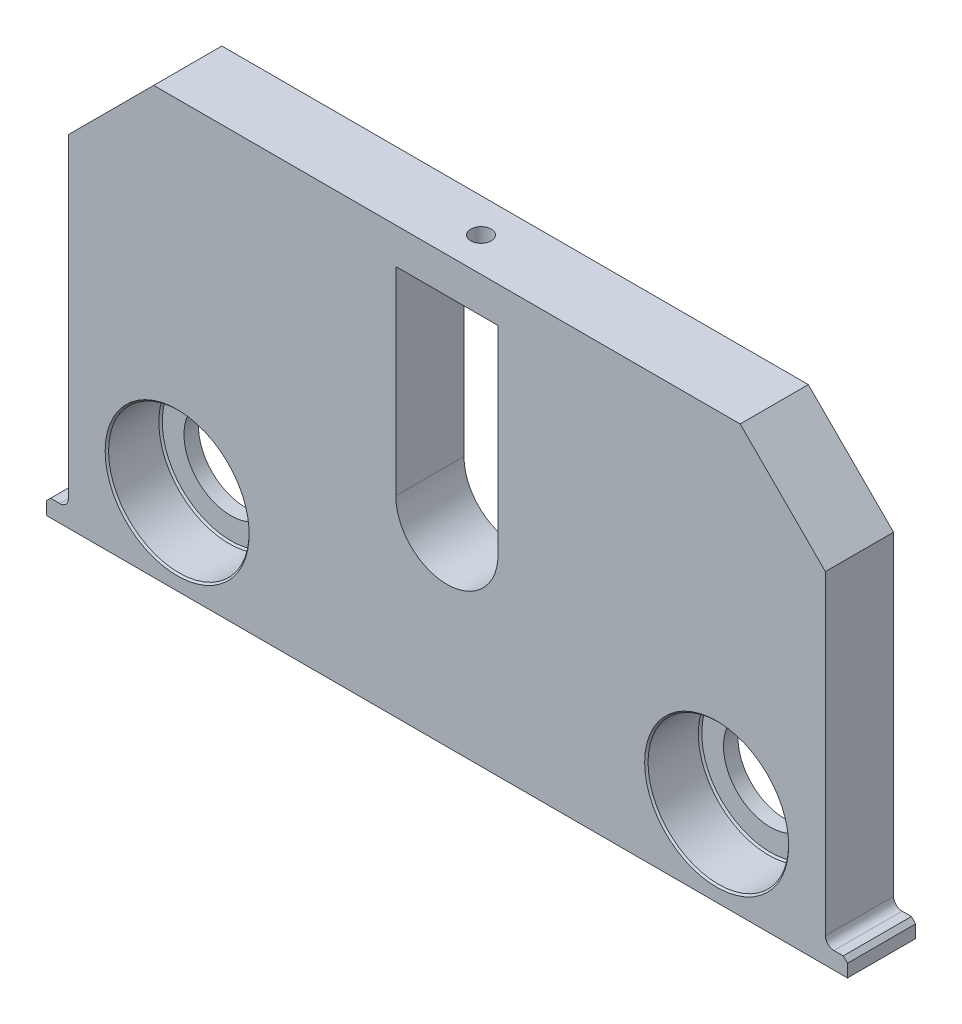
ISO-10303-21;
HEADER;
FILE_DESCRIPTION(('STEP AP214'),'2;1');
FILE_NAME('part.step','',(''),(''),'','','');
FILE_SCHEMA(('AUTOMOTIVE_DESIGN { 1 0 10303 214 1 1 1 1 }'));
ENDSEC;
DATA;
#1=APPLICATION_CONTEXT('core data for automotive mechanical design processes');
#2=APPLICATION_PROTOCOL_DEFINITION('international standard','automotive_design',2000,#1);
#3=PRODUCT_CONTEXT('',#1,'mechanical');
#4=PRODUCT('Part','Part','',(#3));
#5=PRODUCT_RELATED_PRODUCT_CATEGORY('part','',(#4));
#6=PRODUCT_DEFINITION_FORMATION('','',#4);
#7=PRODUCT_DEFINITION_CONTEXT('part definition',#1,'design');
#8=PRODUCT_DEFINITION('design','',#6,#7);
#9=PRODUCT_DEFINITION_SHAPE('','',#8);
#10=(LENGTH_UNIT() NAMED_UNIT(*) SI_UNIT(.MILLI.,.METRE.));
#11=(NAMED_UNIT(*) PLANE_ANGLE_UNIT() SI_UNIT($,.RADIAN.));
#12=(NAMED_UNIT(*) SI_UNIT($,.STERADIAN.) SOLID_ANGLE_UNIT());
#13=UNCERTAINTY_MEASURE_WITH_UNIT(LENGTH_MEASURE(1.E-05),#10,'distance_accuracy_value','');
#14=(GEOMETRIC_REPRESENTATION_CONTEXT(3) GLOBAL_UNCERTAINTY_ASSIGNED_CONTEXT((#13)) GLOBAL_UNIT_ASSIGNED_CONTEXT((#10,
#11,#12)) REPRESENTATION_CONTEXT('',''));
#15=CARTESIAN_POINT('',(0.,0.,0.));
#16=DIRECTION('',(0.,0.,1.));
#17=DIRECTION('',(1.,0.,0.));
#18=AXIS2_PLACEMENT_3D('',#15,#16,#17);
#19=CARTESIAN_POINT('',(-316.5,100.,40.));
#20=DIRECTION('',(0.,0.,-1.));
#21=DIRECTION('',(-1.,0.,0.));
#22=AXIS2_PLACEMENT_3D('',#19,#20,#21);
#23=CYLINDRICAL_SURFACE('',#22,55.);
#24=CARTESIAN_POINT('',(-316.5,100.,-40.));
#25=DIRECTION('',(0.,0.,1.));
#26=DIRECTION('',(1.,0.,0.));
#27=AXIS2_PLACEMENT_3D('',#24,#25,#26);
#28=CIRCLE('',#27,55.);
#29=CARTESIAN_POINT('',(-261.5,100.,-40.));
#30=VERTEX_POINT('',#29);
#31=EDGE_CURVE('E208',#30,#30,#28,.T.);
#32=ORIENTED_EDGE('',*,*,#31,.F.);
#33=EDGE_LOOP('',(#32));
#34=FACE_BOUND('',#33,.T.);
#35=CARTESIAN_POINT('',(-316.5,100.,-23.));
#36=DIRECTION('',(0.,0.,1.));
#37=DIRECTION('',(1.,0.,0.));
#38=AXIS2_PLACEMENT_3D('',#35,#36,#37);
#39=CIRCLE('',#38,55.);
#40=CARTESIAN_POINT('',(-261.5,100.,-23.));
#41=VERTEX_POINT('',#40);
#42=EDGE_CURVE('E570',#41,#41,#39,.T.);
#43=ORIENTED_EDGE('',*,*,#42,.T.);
#44=EDGE_LOOP('',(#43));
#45=FACE_BOUND('',#44,.T.);
#46=ADVANCED_FACE('F35',(#34,#45),#23,.F.);
#47=CARTESIAN_POINT('',(316.5,100.,40.));
#48=DIRECTION('',(0.,0.,-1.));
#49=DIRECTION('',(-1.,0.,0.));
#50=AXIS2_PLACEMENT_3D('',#47,#48,#49);
#51=CYLINDRICAL_SURFACE('',#50,55.);
#52=CARTESIAN_POINT('',(316.5,100.,-40.));
#53=DIRECTION('',(0.,0.,1.));
#54=DIRECTION('',(-1.,0.,0.));
#55=AXIS2_PLACEMENT_3D('',#52,#53,#54);
#56=CIRCLE('',#55,55.);
#57=CARTESIAN_POINT('',(261.5,100.,-40.));
#58=VERTEX_POINT('',#57);
#59=EDGE_CURVE('E180',#58,#58,#56,.T.);
#60=ORIENTED_EDGE('',*,*,#59,.F.);
#61=EDGE_LOOP('',(#60));
#62=FACE_BOUND('',#61,.T.);
#63=CARTESIAN_POINT('',(316.5,100.,-23.));
#64=DIRECTION('',(0.,0.,1.));
#65=DIRECTION('',(1.,0.,0.));
#66=AXIS2_PLACEMENT_3D('',#63,#64,#65);
#67=CIRCLE('',#66,55.);
#68=CARTESIAN_POINT('',(371.5,100.,-23.));
#69=VERTEX_POINT('',#68);
#70=EDGE_CURVE('E572',#69,#69,#67,.T.);
#71=ORIENTED_EDGE('',*,*,#70,.T.);
#72=EDGE_LOOP('',(#71));
#73=FACE_BOUND('',#72,.T.);
#74=ADVANCED_FACE('F342',(#62,#73),#51,.F.);
#75=CARTESIAN_POINT('',(0.,0.,40.));
#76=DIRECTION('',(0.,0.,-1.));
#77=DIRECTION('',(-1.,0.,0.));
#78=AXIS2_PLACEMENT_3D('',#75,#76,#77);
#79=PLANE('',#78);
#80=CARTESIAN_POINT('',(316.5,100.,40.));
#81=DIRECTION('',(0.,0.,-1.));
#82=DIRECTION('',(-1.,0.,0.));
#83=AXIS2_PLACEMENT_3D('',#80,#81,#82);
#84=CIRCLE('',#83,84.5);
#85=CARTESIAN_POINT('',(232.,100.,40.));
#86=VERTEX_POINT('',#85);
#87=EDGE_CURVE('E322',#86,#86,#84,.T.);
#88=ORIENTED_EDGE('',*,*,#87,.T.);
#89=EDGE_LOOP('',(#88));
#90=FACE_BOUND('',#89,.T.);
#91=CARTESIAN_POINT('',(-316.5,100.,40.));
#92=DIRECTION('',(0.,0.,-1.));
#93=DIRECTION('',(-1.,0.,0.));
#94=AXIS2_PLACEMENT_3D('',#91,#92,#93);
#95=CIRCLE('',#94,84.5);
#96=CARTESIAN_POINT('',(-401.,100.,40.));
#97=VERTEX_POINT('',#96);
#98=EDGE_CURVE('E319',#97,#97,#95,.T.);
#99=ORIENTED_EDGE('',*,*,#98,.T.);
#100=EDGE_LOOP('',(#99));
#101=FACE_BOUND('',#100,.T.);
#102=DIRECTION('',(-0.707106781186548,-0.707106781186547,0.));
#103=VECTOR('',#102,1.);
#104=CARTESIAN_POINT('',(-444.063252294249,399.999122502966,40.));
#105=LINE('',#104,#103);
#106=CARTESIAN_POINT('',(-344.063252294249,499.999122502966,40.));
#107=VERTEX_POINT('',#106);
#108=CARTESIAN_POINT('',(-444.063252294249,399.999122502966,40.));
#109=VERTEX_POINT('',#108);
#110=EDGE_CURVE('E212',#107,#109,#105,.T.);
#111=ORIENTED_EDGE('',*,*,#110,.T.);
#112=DIRECTION('',(0.,-1.,0.));
#113=VECTOR('',#112,1.);
#114=CARTESIAN_POINT('',(-444.063252294249,20.,40.));
#115=LINE('',#114,#113);
#116=CARTESIAN_POINT('',(-444.063252294249,30.,40.));
#117=VERTEX_POINT('',#116);
#118=EDGE_CURVE('E215',#109,#117,#115,.T.);
#119=ORIENTED_EDGE('',*,*,#118,.T.);
#120=CARTESIAN_POINT('',(-454.063252294249,30.,40.));
#121=DIRECTION('',(0.,0.,-1.));
#122=DIRECTION('',(-1.,0.,0.));
#123=AXIS2_PLACEMENT_3D('',#120,#121,#122);
#124=CIRCLE('',#123,10.);
#125=CARTESIAN_POINT('',(-454.063252294249,20.,40.));
#126=VERTEX_POINT('',#125);
#127=EDGE_CURVE('E308',#117,#126,#124,.T.);
#128=ORIENTED_EDGE('',*,*,#127,.T.);
#129=DIRECTION('',(-1.,0.,0.));
#130=VECTOR('',#129,1.);
#131=CARTESIAN_POINT('',(-465.,20.,40.));
#132=LINE('',#131,#130);
#133=CARTESIAN_POINT('',(-465.,20.,40.));
#134=VERTEX_POINT('',#133);
#135=EDGE_CURVE('E218',#126,#134,#132,.T.);
#136=ORIENTED_EDGE('',*,*,#135,.T.);
#137=DIRECTION('',(-0.707106781186548,-0.707106781186547,0.));
#138=VECTOR('',#137,1.);
#139=CARTESIAN_POINT('',(-470.,15.,40.));
#140=LINE('',#139,#138);
#141=CARTESIAN_POINT('',(-470.,15.,40.));
#142=VERTEX_POINT('',#141);
#143=EDGE_CURVE('E220',#134,#142,#140,.T.);
#144=ORIENTED_EDGE('',*,*,#143,.T.);
#145=DIRECTION('',(0.,-1.,0.));
#146=VECTOR('',#145,1.);
#147=CARTESIAN_POINT('',(-470.,0.,40.));
#148=LINE('',#147,#146);
#149=CARTESIAN_POINT('',(-470.,0.,40.));
#150=VERTEX_POINT('',#149);
#151=EDGE_CURVE('E222',#142,#150,#148,.T.);
#152=ORIENTED_EDGE('',*,*,#151,.T.);
#153=DIRECTION('',(1.,0.,0.));
#154=VECTOR('',#153,1.);
#155=CARTESIAN_POINT('',(-445.,0.,40.));
#156=LINE('',#155,#154);
#157=CARTESIAN_POINT('',(470.,0.,40.));
#158=VERTEX_POINT('',#157);
#159=EDGE_CURVE('E224',#150,#158,#156,.T.);
#160=ORIENTED_EDGE('',*,*,#159,.T.);
#161=DIRECTION('',(0.,1.,0.));
#162=VECTOR('',#161,1.);
#163=CARTESIAN_POINT('',(470.,0.,40.));
#164=LINE('',#163,#162);
#165=CARTESIAN_POINT('',(470.,15.,40.));
#166=VERTEX_POINT('',#165);
#167=EDGE_CURVE('E226',#158,#166,#164,.T.);
#168=ORIENTED_EDGE('',*,*,#167,.T.);
#169=DIRECTION('',(-0.707106781186548,0.707106781186547,0.));
#170=VECTOR('',#169,1.);
#171=CARTESIAN_POINT('',(470.,15.,40.));
#172=LINE('',#171,#170);
#173=CARTESIAN_POINT('',(465.,20.,40.));
#174=VERTEX_POINT('',#173);
#175=EDGE_CURVE('E228',#166,#174,#172,.T.);
#176=ORIENTED_EDGE('',*,*,#175,.T.);
#177=DIRECTION('',(-1.,0.,0.));
#178=VECTOR('',#177,1.);
#179=CARTESIAN_POINT('',(465.,20.,40.));
#180=LINE('',#179,#178);
#181=CARTESIAN_POINT('',(454.063252294249,20.,40.));
#182=VERTEX_POINT('',#181);
#183=EDGE_CURVE('E230',#174,#182,#180,.T.);
#184=ORIENTED_EDGE('',*,*,#183,.T.);
#185=CARTESIAN_POINT('',(454.063252294249,30.,40.));
#186=DIRECTION('',(0.,0.,-1.));
#187=DIRECTION('',(-1.,0.,0.));
#188=AXIS2_PLACEMENT_3D('',#185,#186,#187);
#189=CIRCLE('',#188,10.);
#190=CARTESIAN_POINT('',(444.063252294249,30.0000000000001,40.));
#191=VERTEX_POINT('',#190);
#192=EDGE_CURVE('E305',#182,#191,#189,.T.);
#193=ORIENTED_EDGE('',*,*,#192,.T.);
#194=DIRECTION('',(0.,1.,0.));
#195=VECTOR('',#194,1.);
#196=CARTESIAN_POINT('',(444.063252294249,399.999122502966,40.));
#197=LINE('',#196,#195);
#198=CARTESIAN_POINT('',(444.063252294249,399.999122502966,40.));
#199=VERTEX_POINT('',#198);
#200=EDGE_CURVE('E233',#191,#199,#197,.T.);
#201=ORIENTED_EDGE('',*,*,#200,.T.);
#202=DIRECTION('',(-0.707106781186548,0.707106781186547,0.));
#203=VECTOR('',#202,1.);
#204=CARTESIAN_POINT('',(344.063252294249,499.999122502966,40.));
#205=LINE('',#204,#203);
#206=CARTESIAN_POINT('',(344.063252294249,499.999122502966,40.));
#207=VERTEX_POINT('',#206);
#208=EDGE_CURVE('E235',#199,#207,#205,.T.);
#209=ORIENTED_EDGE('',*,*,#208,.T.);
#210=DIRECTION('',(-1.,0.,0.));
#211=VECTOR('',#210,1.);
#212=CARTESIAN_POINT('',(-344.063252294249,499.999122502966,40.));
#213=LINE('',#212,#211);
#214=EDGE_CURVE('E237',#207,#107,#213,.T.);
#215=ORIENTED_EDGE('',*,*,#214,.T.);
#216=EDGE_LOOP('',(#111,#119,#128,#136,#144,#152,#160,#168,#176,#184,#193,#201,#209,#215));
#217=FACE_BOUND('',#216,.T.);
#218=DIRECTION('',(0.,1.,0.));
#219=VECTOR('',#218,1.);
#220=CARTESIAN_POINT('',(60.,457.999122502966,40.));
#221=LINE('',#220,#219);
#222=CARTESIAN_POINT('',(60.,225.,40.));
#223=VERTEX_POINT('',#222);
#224=CARTESIAN_POINT('',(60.,457.999122502966,40.));
#225=VERTEX_POINT('',#224);
#226=EDGE_CURVE('E162',#223,#225,#221,.T.);
#227=ORIENTED_EDGE('',*,*,#226,.F.);
#228=CARTESIAN_POINT('',(0.,225.,40.));
#229=DIRECTION('',(0.,0.,1.));
#230=DIRECTION('',(1.,0.,0.));
#231=AXIS2_PLACEMENT_3D('',#228,#229,#230);
#232=CIRCLE('',#231,60.);
#233=CARTESIAN_POINT('',(-60.,225.,40.));
#234=VERTEX_POINT('',#233);
#235=EDGE_CURVE('E188',#234,#223,#232,.T.);
#236=ORIENTED_EDGE('',*,*,#235,.F.);
#237=DIRECTION('',(0.,-1.,0.));
#238=VECTOR('',#237,1.);
#239=CARTESIAN_POINT('',(-60.,457.999122502966,40.));
#240=LINE('',#239,#238);
#241=CARTESIAN_POINT('',(-60.,457.999122502966,40.));
#242=VERTEX_POINT('',#241);
#243=EDGE_CURVE('E186',#242,#234,#240,.T.);
#244=ORIENTED_EDGE('',*,*,#243,.F.);
#245=DIRECTION('',(-1.,0.,0.));
#246=VECTOR('',#245,1.);
#247=CARTESIAN_POINT('',(-60.,457.999122502966,40.));
#248=LINE('',#247,#246);
#249=EDGE_CURVE('E172',#225,#242,#248,.T.);
#250=ORIENTED_EDGE('',*,*,#249,.F.);
#251=EDGE_LOOP('',(#227,#236,#244,#250));
#252=FACE_BOUND('',#251,.T.);
#253=ADVANCED_FACE('F184',(#90,#101,#217,#252),#79,.F.);
#254=CARTESIAN_POINT('',(0.,0.,-40.));
#255=DIRECTION('',(0.,0.,-1.));
#256=DIRECTION('',(-1.,0.,0.));
#257=AXIS2_PLACEMENT_3D('',#254,#255,#256);
#258=PLANE('',#257);
#259=ORIENTED_EDGE('',*,*,#31,.T.);
#260=EDGE_LOOP('',(#259));
#261=FACE_BOUND('',#260,.T.);
#262=DIRECTION('',(-0.707106781186548,-0.707106781186547,0.));
#263=VECTOR('',#262,1.);
#264=CARTESIAN_POINT('',(-444.063252294249,399.999122502966,-40.));
#265=LINE('',#264,#263);
#266=CARTESIAN_POINT('',(-344.063252294249,499.999122502966,-40.));
#267=VERTEX_POINT('',#266);
#268=CARTESIAN_POINT('',(-444.063252294249,399.999122502966,-40.));
#269=VERTEX_POINT('',#268);
#270=EDGE_CURVE('E211',#267,#269,#265,.T.);
#271=ORIENTED_EDGE('',*,*,#270,.F.);
#272=DIRECTION('',(-1.,0.,0.));
#273=VECTOR('',#272,1.);
#274=CARTESIAN_POINT('',(-344.063252294249,499.999122502966,-40.));
#275=LINE('',#274,#273);
#276=CARTESIAN_POINT('',(344.063252294249,499.999122502966,-40.));
#277=VERTEX_POINT('',#276);
#278=EDGE_CURVE('E216',#277,#267,#275,.T.);
#279=ORIENTED_EDGE('',*,*,#278,.F.);
#280=DIRECTION('',(-0.707106781186548,0.707106781186547,0.));
#281=VECTOR('',#280,1.);
#282=CARTESIAN_POINT('',(344.063252294249,499.999122502966,-40.));
#283=LINE('',#282,#281);
#284=CARTESIAN_POINT('',(444.063252294249,399.999122502966,-40.));
#285=VERTEX_POINT('',#284);
#286=EDGE_CURVE('E262',#285,#277,#283,.T.);
#287=ORIENTED_EDGE('',*,*,#286,.F.);
#288=DIRECTION('',(0.,1.,0.));
#289=VECTOR('',#288,1.);
#290=CARTESIAN_POINT('',(444.063252294249,399.999122502966,-40.));
#291=LINE('',#290,#289);
#292=CARTESIAN_POINT('',(444.063252294249,30.0000000000001,-40.));
#293=VERTEX_POINT('',#292);
#294=EDGE_CURVE('E260',#293,#285,#291,.T.);
#295=ORIENTED_EDGE('',*,*,#294,.F.);
#296=CARTESIAN_POINT('',(454.063252294249,30.,-40.));
#297=DIRECTION('',(0.,0.,-1.));
#298=DIRECTION('',(-1.,0.,0.));
#299=AXIS2_PLACEMENT_3D('',#296,#297,#298);
#300=CIRCLE('',#299,10.);
#301=CARTESIAN_POINT('',(454.063252294249,20.,-40.));
#302=VERTEX_POINT('',#301);
#303=EDGE_CURVE('E303',#293,#302,#300,.F.);
#304=ORIENTED_EDGE('',*,*,#303,.T.);
#305=DIRECTION('',(-1.,0.,0.));
#306=VECTOR('',#305,1.);
#307=CARTESIAN_POINT('',(465.,20.,-40.));
#308=LINE('',#307,#306);
#309=CARTESIAN_POINT('',(465.,20.,-40.));
#310=VERTEX_POINT('',#309);
#311=EDGE_CURVE('E257',#310,#302,#308,.T.);
#312=ORIENTED_EDGE('',*,*,#311,.F.);
#313=DIRECTION('',(-0.707106781186548,0.707106781186547,0.));
#314=VECTOR('',#313,1.);
#315=CARTESIAN_POINT('',(470.,15.,-40.));
#316=LINE('',#315,#314);
#317=CARTESIAN_POINT('',(470.,15.,-40.));
#318=VERTEX_POINT('',#317);
#319=EDGE_CURVE('E255',#318,#310,#316,.T.);
#320=ORIENTED_EDGE('',*,*,#319,.F.);
#321=DIRECTION('',(0.,1.,0.));
#322=VECTOR('',#321,1.);
#323=CARTESIAN_POINT('',(470.,0.,-40.));
#324=LINE('',#323,#322);
#325=CARTESIAN_POINT('',(470.,0.,-40.));
#326=VERTEX_POINT('',#325);
#327=EDGE_CURVE('E253',#326,#318,#324,.T.);
#328=ORIENTED_EDGE('',*,*,#327,.F.);
#329=DIRECTION('',(1.,0.,0.));
#330=VECTOR('',#329,1.);
#331=CARTESIAN_POINT('',(445.,1.63490347686172E-13,-40.));
#332=LINE('',#331,#330);
#333=CARTESIAN_POINT('',(-470.,0.,-40.));
#334=VERTEX_POINT('',#333);
#335=EDGE_CURVE('E251',#334,#326,#332,.T.);
#336=ORIENTED_EDGE('',*,*,#335,.F.);
#337=DIRECTION('',(0.,-1.,0.));
#338=VECTOR('',#337,1.);
#339=CARTESIAN_POINT('',(-470.,0.,-40.));
#340=LINE('',#339,#338);
#341=CARTESIAN_POINT('',(-470.,15.,-40.));
#342=VERTEX_POINT('',#341);
#343=EDGE_CURVE('E248',#342,#334,#340,.T.);
#344=ORIENTED_EDGE('',*,*,#343,.F.);
#345=DIRECTION('',(-0.707106781186548,-0.707106781186547,0.));
#346=VECTOR('',#345,1.);
#347=CARTESIAN_POINT('',(-470.,15.,-40.));
#348=LINE('',#347,#346);
#349=CARTESIAN_POINT('',(-465.,20.,-40.));
#350=VERTEX_POINT('',#349);
#351=EDGE_CURVE('E246',#350,#342,#348,.T.);
#352=ORIENTED_EDGE('',*,*,#351,.F.);
#353=DIRECTION('',(-1.,0.,0.));
#354=VECTOR('',#353,1.);
#355=CARTESIAN_POINT('',(-465.,20.,-40.));
#356=LINE('',#355,#354);
#357=CARTESIAN_POINT('',(-454.063252294249,20.,-40.));
#358=VERTEX_POINT('',#357);
#359=EDGE_CURVE('E244',#358,#350,#356,.T.);
#360=ORIENTED_EDGE('',*,*,#359,.F.);
#361=CARTESIAN_POINT('',(-454.063252294249,30.,-40.));
#362=DIRECTION('',(0.,0.,-1.));
#363=DIRECTION('',(-1.,0.,0.));
#364=AXIS2_PLACEMENT_3D('',#361,#362,#363);
#365=CIRCLE('',#364,10.);
#366=CARTESIAN_POINT('',(-444.063252294249,30.,-40.));
#367=VERTEX_POINT('',#366);
#368=EDGE_CURVE('E59',#358,#367,#365,.F.);
#369=ORIENTED_EDGE('',*,*,#368,.T.);
#370=DIRECTION('',(0.,-1.,0.));
#371=VECTOR('',#370,1.);
#372=CARTESIAN_POINT('',(-444.063252294249,20.,-40.));
#373=LINE('',#372,#371);
#374=EDGE_CURVE('E242',#269,#367,#373,.T.);
#375=ORIENTED_EDGE('',*,*,#374,.F.);
#376=EDGE_LOOP('',(#271,#279,#287,#295,#304,#312,#320,#328,#336,#344,#352,#360,#369,#375));
#377=FACE_BOUND('',#376,.T.);
#378=ORIENTED_EDGE('',*,*,#59,.T.);
#379=EDGE_LOOP('',(#378));
#380=FACE_BOUND('',#379,.T.);
#381=CARTESIAN_POINT('',(0.,225.,-40.));
#382=DIRECTION('',(0.,0.,1.));
#383=DIRECTION('',(1.,0.,0.));
#384=AXIS2_PLACEMENT_3D('',#381,#382,#383);
#385=CIRCLE('',#384,60.);
#386=CARTESIAN_POINT('',(-60.,225.,-40.));
#387=VERTEX_POINT('',#386);
#388=CARTESIAN_POINT('',(60.,225.,-40.));
#389=VERTEX_POINT('',#388);
#390=EDGE_CURVE('E173',#387,#389,#385,.T.);
#391=ORIENTED_EDGE('',*,*,#390,.T.);
#392=DIRECTION('',(0.,1.,0.));
#393=VECTOR('',#392,1.);
#394=CARTESIAN_POINT('',(60.,457.999122502966,-40.));
#395=LINE('',#394,#393);
#396=CARTESIAN_POINT('',(60.,457.999122502966,-40.));
#397=VERTEX_POINT('',#396);
#398=EDGE_CURVE('E193',#389,#397,#395,.T.);
#399=ORIENTED_EDGE('',*,*,#398,.T.);
#400=DIRECTION('',(-1.,0.,0.));
#401=VECTOR('',#400,1.);
#402=CARTESIAN_POINT('',(-60.,457.999122502966,-40.));
#403=LINE('',#402,#401);
#404=CARTESIAN_POINT('',(-60.,457.999122502966,-40.));
#405=VERTEX_POINT('',#404);
#406=EDGE_CURVE('E179',#397,#405,#403,.T.);
#407=ORIENTED_EDGE('',*,*,#406,.T.);
#408=DIRECTION('',(0.,-1.,0.));
#409=VECTOR('',#408,1.);
#410=CARTESIAN_POINT('',(-60.,457.999122502966,-40.));
#411=LINE('',#410,#409);
#412=EDGE_CURVE('E197',#405,#387,#411,.T.);
#413=ORIENTED_EDGE('',*,*,#412,.T.);
#414=EDGE_LOOP('',(#391,#399,#407,#413));
#415=FACE_BOUND('',#414,.T.);
#416=ADVANCED_FACE('F356',(#261,#377,#380,#415),#258,.T.);
#417=CARTESIAN_POINT('',(-444.063252294249,399.999122502966,40.));
#418=DIRECTION('',(0.707106781186547,-0.707106781186548,0.));
#419=DIRECTION('',(0.707106781186548,0.707106781186547,0.));
#420=AXIS2_PLACEMENT_3D('',#417,#418,#419);
#421=PLANE('',#420);
#422=ORIENTED_EDGE('',*,*,#270,.T.);
#423=DIRECTION('',(0.,0.,-1.));
#424=VECTOR('',#423,1.);
#425=CARTESIAN_POINT('',(-444.063252294249,399.999122502966,40.));
#426=LINE('',#425,#424);
#427=EDGE_CURVE('E291',#109,#269,#426,.T.);
#428=ORIENTED_EDGE('',*,*,#427,.F.);
#429=ORIENTED_EDGE('',*,*,#110,.F.);
#430=DIRECTION('',(0.,0.,-1.));
#431=VECTOR('',#430,1.);
#432=CARTESIAN_POINT('',(-344.063252294249,499.999122502966,40.));
#433=LINE('',#432,#431);
#434=EDGE_CURVE('E239',#107,#267,#433,.T.);
#435=ORIENTED_EDGE('',*,*,#434,.T.);
#436=EDGE_LOOP('',(#422,#428,#429,#435));
#437=FACE_BOUND('',#436,.T.);
#438=ADVANCED_FACE('F360',(#437),#421,.F.);
#439=CARTESIAN_POINT('',(-444.063252294249,20.,40.));
#440=DIRECTION('',(1.,0.,0.));
#441=DIRECTION('',(0.,0.,-1.));
#442=AXIS2_PLACEMENT_3D('',#439,#440,#441);
#443=PLANE('',#442);
#444=ORIENTED_EDGE('',*,*,#374,.T.);
#445=DIRECTION('',(0.,0.,-1.));
#446=VECTOR('',#445,1.);
#447=CARTESIAN_POINT('',(-444.063252294249,30.,40.));
#448=LINE('',#447,#446);
#449=EDGE_CURVE('E51',#367,#117,#448,.F.);
#450=ORIENTED_EDGE('',*,*,#449,.T.);
#451=ORIENTED_EDGE('',*,*,#118,.F.);
#452=ORIENTED_EDGE('',*,*,#427,.T.);
#453=EDGE_LOOP('',(#444,#450,#451,#452));
#454=FACE_BOUND('',#453,.T.);
#455=ADVANCED_FACE('F401',(#454),#443,.F.);
#456=CARTESIAN_POINT('',(-465.,20.,40.));
#457=DIRECTION('',(0.,-1.,0.));
#458=DIRECTION('',(1.,0.,0.));
#459=AXIS2_PLACEMENT_3D('',#456,#457,#458);
#460=PLANE('',#459);
#461=ORIENTED_EDGE('',*,*,#135,.F.);
#462=DIRECTION('',(0.,0.,-1.));
#463=VECTOR('',#462,1.);
#464=CARTESIAN_POINT('',(-454.063252294249,20.,-40.));
#465=LINE('',#464,#463);
#466=EDGE_CURVE('E299',#126,#358,#465,.T.);
#467=ORIENTED_EDGE('',*,*,#466,.T.);
#468=ORIENTED_EDGE('',*,*,#359,.T.);
#469=DIRECTION('',(0.,0.,-1.));
#470=VECTOR('',#469,1.);
#471=CARTESIAN_POINT('',(-465.,20.,40.));
#472=LINE('',#471,#470);
#473=EDGE_CURVE('E288',#134,#350,#472,.T.);
#474=ORIENTED_EDGE('',*,*,#473,.F.);
#475=EDGE_LOOP('',(#461,#467,#468,#474));
#476=FACE_BOUND('',#475,.T.);
#477=ADVANCED_FACE('F397',(#476),#460,.F.);
#478=CARTESIAN_POINT('',(-470.,15.,40.));
#479=DIRECTION('',(0.707106781186547,-0.707106781186548,0.));
#480=DIRECTION('',(0.707106781186548,0.707106781186547,0.));
#481=AXIS2_PLACEMENT_3D('',#478,#479,#480);
#482=PLANE('',#481);
#483=ORIENTED_EDGE('',*,*,#351,.T.);
#484=DIRECTION('',(0.,0.,-1.));
#485=VECTOR('',#484,1.);
#486=CARTESIAN_POINT('',(-470.,15.,40.));
#487=LINE('',#486,#485);
#488=EDGE_CURVE('E285',#142,#342,#487,.T.);
#489=ORIENTED_EDGE('',*,*,#488,.F.);
#490=ORIENTED_EDGE('',*,*,#143,.F.);
#491=ORIENTED_EDGE('',*,*,#473,.T.);
#492=EDGE_LOOP('',(#483,#489,#490,#491));
#493=FACE_BOUND('',#492,.T.);
#494=ADVANCED_FACE('F393',(#493),#482,.F.);
#495=CARTESIAN_POINT('',(-470.,0.,40.));
#496=DIRECTION('',(1.,0.,0.));
#497=DIRECTION('',(0.,0.,-1.));
#498=AXIS2_PLACEMENT_3D('',#495,#496,#497);
#499=PLANE('',#498);
#500=ORIENTED_EDGE('',*,*,#343,.T.);
#501=DIRECTION('',(0.,0.,-1.));
#502=VECTOR('',#501,1.);
#503=CARTESIAN_POINT('',(-470.,0.,40.));
#504=LINE('',#503,#502);
#505=EDGE_CURVE('E282',#150,#334,#504,.T.);
#506=ORIENTED_EDGE('',*,*,#505,.F.);
#507=ORIENTED_EDGE('',*,*,#151,.F.);
#508=ORIENTED_EDGE('',*,*,#488,.T.);
#509=EDGE_LOOP('',(#500,#506,#507,#508));
#510=FACE_BOUND('',#509,.T.);
#511=ADVANCED_FACE('F389',(#510),#499,.F.);
#512=CARTESIAN_POINT('',(445.,1.63490347686172E-13,40.));
#513=DIRECTION('',(0.,1.,0.));
#514=DIRECTION('',(-1.,0.,0.));
#515=AXIS2_PLACEMENT_3D('',#512,#513,#514);
#516=PLANE('',#515);
#517=ORIENTED_EDGE('',*,*,#335,.T.);
#518=DIRECTION('',(0.,0.,-1.));
#519=VECTOR('',#518,1.);
#520=CARTESIAN_POINT('',(470.,0.,40.));
#521=LINE('',#520,#519);
#522=EDGE_CURVE('E279',#158,#326,#521,.T.);
#523=ORIENTED_EDGE('',*,*,#522,.F.);
#524=ORIENTED_EDGE('',*,*,#159,.F.);
#525=ORIENTED_EDGE('',*,*,#505,.T.);
#526=EDGE_LOOP('',(#517,#523,#524,#525));
#527=FACE_BOUND('',#526,.T.);
#528=ADVANCED_FACE('F385',(#527),#516,.F.);
#529=CARTESIAN_POINT('',(470.,0.,40.));
#530=DIRECTION('',(-1.,0.,0.));
#531=DIRECTION('',(0.,0.,1.));
#532=AXIS2_PLACEMENT_3D('',#529,#530,#531);
#533=PLANE('',#532);
#534=ORIENTED_EDGE('',*,*,#327,.T.);
#535=DIRECTION('',(0.,0.,-1.));
#536=VECTOR('',#535,1.);
#537=CARTESIAN_POINT('',(470.,15.,40.));
#538=LINE('',#537,#536);
#539=EDGE_CURVE('E276',#166,#318,#538,.T.);
#540=ORIENTED_EDGE('',*,*,#539,.F.);
#541=ORIENTED_EDGE('',*,*,#167,.F.);
#542=ORIENTED_EDGE('',*,*,#522,.T.);
#543=EDGE_LOOP('',(#534,#540,#541,#542));
#544=FACE_BOUND('',#543,.T.);
#545=ADVANCED_FACE('F381',(#544),#533,.F.);
#546=CARTESIAN_POINT('',(470.,15.,40.));
#547=DIRECTION('',(-0.707106781186547,-0.707106781186548,0.));
#548=DIRECTION('',(0.707106781186548,-0.707106781186547,0.));
#549=AXIS2_PLACEMENT_3D('',#546,#547,#548);
#550=PLANE('',#549);
#551=ORIENTED_EDGE('',*,*,#319,.T.);
#552=DIRECTION('',(0.,0.,-1.));
#553=VECTOR('',#552,1.);
#554=CARTESIAN_POINT('',(465.,20.,40.));
#555=LINE('',#554,#553);
#556=EDGE_CURVE('E273',#174,#310,#555,.T.);
#557=ORIENTED_EDGE('',*,*,#556,.F.);
#558=ORIENTED_EDGE('',*,*,#175,.F.);
#559=ORIENTED_EDGE('',*,*,#539,.T.);
#560=EDGE_LOOP('',(#551,#557,#558,#559));
#561=FACE_BOUND('',#560,.T.);
#562=ADVANCED_FACE('F377',(#561),#550,.F.);
#563=CARTESIAN_POINT('',(465.,20.,40.));
#564=DIRECTION('',(0.,-1.,0.));
#565=DIRECTION('',(1.,0.,0.));
#566=AXIS2_PLACEMENT_3D('',#563,#564,#565);
#567=PLANE('',#566);
#568=ORIENTED_EDGE('',*,*,#311,.T.);
#569=DIRECTION('',(0.,0.,-1.));
#570=VECTOR('',#569,1.);
#571=CARTESIAN_POINT('',(454.063252294249,20.,40.));
#572=LINE('',#571,#570);
#573=EDGE_CURVE('E297',#302,#182,#572,.F.);
#574=ORIENTED_EDGE('',*,*,#573,.T.);
#575=ORIENTED_EDGE('',*,*,#183,.F.);
#576=ORIENTED_EDGE('',*,*,#556,.T.);
#577=EDGE_LOOP('',(#568,#574,#575,#576));
#578=FACE_BOUND('',#577,.T.);
#579=ADVANCED_FACE('F373',(#578),#567,.F.);
#580=CARTESIAN_POINT('',(444.063252294249,399.999122502966,40.));
#581=DIRECTION('',(-1.,0.,0.));
#582=DIRECTION('',(0.,0.,1.));
#583=AXIS2_PLACEMENT_3D('',#580,#581,#582);
#584=PLANE('',#583);
#585=ORIENTED_EDGE('',*,*,#200,.F.);
#586=DIRECTION('',(0.,0.,-1.));
#587=VECTOR('',#586,1.);
#588=CARTESIAN_POINT('',(444.063252294249,30.,-40.));
#589=LINE('',#588,#587);
#590=EDGE_CURVE('E294',#191,#293,#589,.T.);
#591=ORIENTED_EDGE('',*,*,#590,.T.);
#592=ORIENTED_EDGE('',*,*,#294,.T.);
#593=DIRECTION('',(0.,0.,-1.));
#594=VECTOR('',#593,1.);
#595=CARTESIAN_POINT('',(444.063252294249,399.999122502966,40.));
#596=LINE('',#595,#594);
#597=EDGE_CURVE('E270',#199,#285,#596,.T.);
#598=ORIENTED_EDGE('',*,*,#597,.F.);
#599=EDGE_LOOP('',(#585,#591,#592,#598));
#600=FACE_BOUND('',#599,.T.);
#601=ADVANCED_FACE('F369',(#600),#584,.F.);
#602=CARTESIAN_POINT('',(344.063252294249,499.999122502966,40.));
#603=DIRECTION('',(-0.707106781186547,-0.707106781186548,0.));
#604=DIRECTION('',(0.707106781186548,-0.707106781186547,0.));
#605=AXIS2_PLACEMENT_3D('',#602,#603,#604);
#606=PLANE('',#605);
#607=ORIENTED_EDGE('',*,*,#286,.T.);
#608=DIRECTION('',(0.,0.,-1.));
#609=VECTOR('',#608,1.);
#610=CARTESIAN_POINT('',(344.063252294249,499.999122502966,40.));
#611=LINE('',#610,#609);
#612=EDGE_CURVE('E267',#207,#277,#611,.T.);
#613=ORIENTED_EDGE('',*,*,#612,.F.);
#614=ORIENTED_EDGE('',*,*,#208,.F.);
#615=ORIENTED_EDGE('',*,*,#597,.T.);
#616=EDGE_LOOP('',(#607,#613,#614,#615));
#617=FACE_BOUND('',#616,.T.);
#618=ADVANCED_FACE('F365',(#617),#606,.F.);
#619=CARTESIAN_POINT('',(-344.063252294249,499.999122502966,40.));
#620=DIRECTION('',(0.,-1.,0.));
#621=DIRECTION('',(0.,0.,-1.));
#622=AXIS2_PLACEMENT_3D('',#619,#620,#621);
#623=PLANE('',#622);
#624=CARTESIAN_POINT('',(0.,499.999122502966,0.));
#625=DIRECTION('',(0.,-1.,0.));
#626=DIRECTION('',(0.,0.,-1.));
#627=AXIS2_PLACEMENT_3D('',#624,#625,#626);
#628=CIRCLE('',#627,12.);
#629=CARTESIAN_POINT('',(0.,499.999122502966,-12.));
#630=VERTEX_POINT('',#629);
#631=EDGE_CURVE('E195',#630,#630,#628,.T.);
#632=ORIENTED_EDGE('',*,*,#631,.T.);
#633=EDGE_LOOP('',(#632));
#634=FACE_BOUND('',#633,.T.);
#635=ORIENTED_EDGE('',*,*,#278,.T.);
#636=ORIENTED_EDGE('',*,*,#434,.F.);
#637=ORIENTED_EDGE('',*,*,#214,.F.);
#638=ORIENTED_EDGE('',*,*,#612,.T.);
#639=EDGE_LOOP('',(#635,#636,#637,#638));
#640=FACE_BOUND('',#639,.T.);
#641=ADVANCED_FACE('F362',(#634,#640),#623,.F.);
#642=CARTESIAN_POINT('',(60.,457.999122502966,40.));
#643=DIRECTION('',(-1.,0.,0.));
#644=DIRECTION('',(0.,-1.,0.));
#645=AXIS2_PLACEMENT_3D('',#642,#643,#644);
#646=PLANE('',#645);
#647=ORIENTED_EDGE('',*,*,#398,.F.);
#648=DIRECTION('',(0.,0.,-1.));
#649=VECTOR('',#648,1.);
#650=CARTESIAN_POINT('',(60.,225.,40.));
#651=LINE('',#650,#649);
#652=EDGE_CURVE('E168',#223,#389,#651,.T.);
#653=ORIENTED_EDGE('',*,*,#652,.F.);
#654=ORIENTED_EDGE('',*,*,#226,.T.);
#655=DIRECTION('',(0.,0.,-1.));
#656=VECTOR('',#655,1.);
#657=CARTESIAN_POINT('',(60.,457.999122502966,40.));
#658=LINE('',#657,#656);
#659=EDGE_CURVE('E165',#225,#397,#658,.T.);
#660=ORIENTED_EDGE('',*,*,#659,.T.);
#661=EDGE_LOOP('',(#647,#653,#654,#660));
#662=FACE_BOUND('',#661,.T.);
#663=ADVANCED_FACE('F164',(#662),#646,.T.);
#664=CARTESIAN_POINT('',(-60.,457.999122502966,40.));
#665=DIRECTION('',(0.,-1.,0.));
#666=DIRECTION('',(0.,0.,-1.));
#667=AXIS2_PLACEMENT_3D('',#664,#665,#666);
#668=PLANE('',#667);
#669=CARTESIAN_POINT('',(0.,457.999122502966,0.));
#670=DIRECTION('',(0.,-1.,0.));
#671=DIRECTION('',(0.,0.,-1.));
#672=AXIS2_PLACEMENT_3D('',#669,#670,#671);
#673=CIRCLE('',#672,12.);
#674=CARTESIAN_POINT('',(0.,457.999122502966,-12.));
#675=VERTEX_POINT('',#674);
#676=EDGE_CURVE('E571',#675,#675,#673,.T.);
#677=ORIENTED_EDGE('',*,*,#676,.F.);
#678=EDGE_LOOP('',(#677));
#679=FACE_BOUND('',#678,.T.);
#680=ORIENTED_EDGE('',*,*,#406,.F.);
#681=ORIENTED_EDGE('',*,*,#659,.F.);
#682=ORIENTED_EDGE('',*,*,#249,.T.);
#683=DIRECTION('',(0.,0.,-1.));
#684=VECTOR('',#683,1.);
#685=CARTESIAN_POINT('',(-60.,457.999122502966,40.));
#686=LINE('',#685,#684);
#687=EDGE_CURVE('E181',#242,#405,#686,.T.);
#688=ORIENTED_EDGE('',*,*,#687,.T.);
#689=EDGE_LOOP('',(#680,#681,#682,#688));
#690=FACE_BOUND('',#689,.T.);
#691=ADVANCED_FACE('F176',(#679,#690),#668,.T.);
#692=CARTESIAN_POINT('',(-60.,457.999122502966,40.));
#693=DIRECTION('',(1.,0.,0.));
#694=DIRECTION('',(0.,1.,0.));
#695=AXIS2_PLACEMENT_3D('',#692,#693,#694);
#696=PLANE('',#695);
#697=ORIENTED_EDGE('',*,*,#412,.F.);
#698=ORIENTED_EDGE('',*,*,#687,.F.);
#699=ORIENTED_EDGE('',*,*,#243,.T.);
#700=DIRECTION('',(0.,0.,-1.));
#701=VECTOR('',#700,1.);
#702=CARTESIAN_POINT('',(-60.,225.,40.));
#703=LINE('',#702,#701);
#704=EDGE_CURVE('E203',#234,#387,#703,.T.);
#705=ORIENTED_EDGE('',*,*,#704,.T.);
#706=EDGE_LOOP('',(#697,#698,#699,#705));
#707=FACE_BOUND('',#706,.T.);
#708=ADVANCED_FACE('F459',(#707),#696,.T.);
#709=CARTESIAN_POINT('',(0.,225.,40.));
#710=DIRECTION('',(0.,0.,-1.));
#711=DIRECTION('',(-1.,0.,0.));
#712=AXIS2_PLACEMENT_3D('',#709,#710,#711);
#713=CYLINDRICAL_SURFACE('',#712,60.);
#714=ORIENTED_EDGE('',*,*,#390,.F.);
#715=ORIENTED_EDGE('',*,*,#704,.F.);
#716=ORIENTED_EDGE('',*,*,#235,.T.);
#717=ORIENTED_EDGE('',*,*,#652,.T.);
#718=EDGE_LOOP('',(#714,#715,#716,#717));
#719=FACE_BOUND('',#718,.T.);
#720=ADVANCED_FACE('F412',(#719),#713,.F.);
#721=CARTESIAN_POINT('',(454.063252294249,30.,40.));
#722=DIRECTION('',(0.,0.,1.));
#723=DIRECTION('',(1.,0.,0.));
#724=AXIS2_PLACEMENT_3D('',#721,#722,#723);
#725=CYLINDRICAL_SURFACE('',#724,10.);
#726=ORIENTED_EDGE('',*,*,#192,.F.);
#727=ORIENTED_EDGE('',*,*,#573,.F.);
#728=ORIENTED_EDGE('',*,*,#303,.F.);
#729=ORIENTED_EDGE('',*,*,#590,.F.);
#730=EDGE_LOOP('',(#726,#727,#728,#729));
#731=FACE_BOUND('',#730,.T.);
#732=ADVANCED_FACE('F408',(#731),#725,.F.);
#733=CARTESIAN_POINT('',(-454.063252294249,30.,40.));
#734=DIRECTION('',(0.,0.,1.));
#735=DIRECTION('',(1.,0.,0.));
#736=AXIS2_PLACEMENT_3D('',#733,#734,#735);
#737=CYLINDRICAL_SURFACE('',#736,10.);
#738=ORIENTED_EDGE('',*,*,#127,.F.);
#739=ORIENTED_EDGE('',*,*,#449,.F.);
#740=ORIENTED_EDGE('',*,*,#368,.F.);
#741=ORIENTED_EDGE('',*,*,#466,.F.);
#742=EDGE_LOOP('',(#738,#739,#740,#741));
#743=FACE_BOUND('',#742,.T.);
#744=ADVANCED_FACE('F411',(#743),#737,.F.);
#745=CARTESIAN_POINT('',(0.,499.999122502966,0.));
#746=DIRECTION('',(0.,-1.,0.));
#747=DIRECTION('',(0.,0.,-1.));
#748=AXIS2_PLACEMENT_3D('',#745,#746,#747);
#749=CYLINDRICAL_SURFACE('',#748,12.);
#750=ORIENTED_EDGE('',*,*,#631,.F.);
#751=EDGE_LOOP('',(#750));
#752=FACE_BOUND('',#751,.T.);
#753=ORIENTED_EDGE('',*,*,#676,.T.);
#754=EDGE_LOOP('',(#753));
#755=FACE_BOUND('',#754,.T.);
#756=ADVANCED_FACE('F416',(#752,#755),#749,.F.);
#757=CARTESIAN_POINT('',(316.5,100.,-23.));
#758=DIRECTION('',(0.,0.,1.));
#759=DIRECTION('',(1.,0.,0.));
#760=AXIS2_PLACEMENT_3D('',#757,#758,#759);
#761=CYLINDRICAL_SURFACE('',#760,82.5);
#762=CARTESIAN_POINT('',(316.5,100.,-20.9999999999999));
#763=DIRECTION('',(0.,0.,1.));
#764=DIRECTION('',(1.,0.,0.));
#765=AXIS2_PLACEMENT_3D('',#762,#763,#764);
#766=CIRCLE('',#765,82.5);
#767=CARTESIAN_POINT('',(399.,100.,-20.9999999999999));
#768=VERTEX_POINT('',#767);
#769=EDGE_CURVE('E316',#768,#768,#766,.F.);
#770=ORIENTED_EDGE('',*,*,#769,.T.);
#771=EDGE_LOOP('',(#770));
#772=FACE_BOUND('',#771,.T.);
#773=CARTESIAN_POINT('',(316.5,100.,37.9999999999999));
#774=DIRECTION('',(0.,0.,-1.));
#775=DIRECTION('',(-1.,0.,0.));
#776=AXIS2_PLACEMENT_3D('',#773,#774,#775);
#777=CIRCLE('',#776,82.5);
#778=CARTESIAN_POINT('',(234.,100.,37.9999999999999));
#779=VERTEX_POINT('',#778);
#780=EDGE_CURVE('E313',#779,#779,#777,.F.);
#781=ORIENTED_EDGE('',*,*,#780,.T.);
#782=EDGE_LOOP('',(#781));
#783=FACE_BOUND('',#782,.T.);
#784=ADVANCED_FACE('F442',(#772,#783),#761,.F.);
#785=CARTESIAN_POINT('',(316.5,100.,-23.));
#786=DIRECTION('',(0.,0.,1.));
#787=DIRECTION('',(1.,0.,0.));
#788=AXIS2_PLACEMENT_3D('',#785,#786,#787);
#789=PLANE('',#788);
#790=CARTESIAN_POINT('',(316.5,100.,-23.));
#791=DIRECTION('',(0.,0.,1.));
#792=DIRECTION('',(1.,0.,0.));
#793=AXIS2_PLACEMENT_3D('',#790,#791,#792);
#794=CIRCLE('',#793,80.5);
#795=CARTESIAN_POINT('',(397.,100.,-23.));
#796=VERTEX_POINT('',#795);
#797=EDGE_CURVE('E310',#796,#796,#794,.T.);
#798=ORIENTED_EDGE('',*,*,#797,.T.);
#799=EDGE_LOOP('',(#798));
#800=FACE_BOUND('',#799,.T.);
#801=ORIENTED_EDGE('',*,*,#70,.F.);
#802=EDGE_LOOP('',(#801));
#803=FACE_BOUND('',#802,.T.);
#804=ADVANCED_FACE('F444',(#800,#803),#789,.T.);
#805=CARTESIAN_POINT('',(-316.5,100.,-23.));
#806=DIRECTION('',(0.,0.,1.));
#807=DIRECTION('',(1.,0.,0.));
#808=AXIS2_PLACEMENT_3D('',#805,#806,#807);
#809=CYLINDRICAL_SURFACE('',#808,82.5);
#810=CARTESIAN_POINT('',(-316.5,100.,-20.9999999999996));
#811=DIRECTION('',(0.,0.,1.));
#812=DIRECTION('',(1.,0.,0.));
#813=AXIS2_PLACEMENT_3D('',#810,#811,#812);
#814=CIRCLE('',#813,82.5);
#815=CARTESIAN_POINT('',(-234.,100.,-20.9999999999996));
#816=VERTEX_POINT('',#815);
#817=EDGE_CURVE('E11',#816,#816,#814,.F.);
#818=ORIENTED_EDGE('',*,*,#817,.T.);
#819=EDGE_LOOP('',(#818));
#820=FACE_BOUND('',#819,.T.);
#821=CARTESIAN_POINT('',(-316.5,100.,37.9999999999999));
#822=DIRECTION('',(0.,0.,-1.));
#823=DIRECTION('',(-1.,0.,0.));
#824=AXIS2_PLACEMENT_3D('',#821,#822,#823);
#825=CIRCLE('',#824,82.5);
#826=CARTESIAN_POINT('',(-399.,100.,37.9999999999999));
#827=VERTEX_POINT('',#826);
#828=EDGE_CURVE('E44',#827,#827,#825,.F.);
#829=ORIENTED_EDGE('',*,*,#828,.T.);
#830=EDGE_LOOP('',(#829));
#831=FACE_BOUND('',#830,.T.);
#832=ADVANCED_FACE('F330',(#820,#831),#809,.F.);
#833=CARTESIAN_POINT('',(-316.5,100.,-23.));
#834=DIRECTION('',(0.,0.,1.));
#835=DIRECTION('',(1.,0.,0.));
#836=AXIS2_PLACEMENT_3D('',#833,#834,#835);
#837=PLANE('',#836);
#838=CARTESIAN_POINT('',(-316.5,100.,-23.));
#839=DIRECTION('',(0.,0.,1.));
#840=DIRECTION('',(1.,0.,0.));
#841=AXIS2_PLACEMENT_3D('',#838,#839,#840);
#842=CIRCLE('',#841,80.4999999999997);
#843=CARTESIAN_POINT('',(-236.,100.,-23.));
#844=VERTEX_POINT('',#843);
#845=EDGE_CURVE('E325',#844,#844,#842,.T.);
#846=ORIENTED_EDGE('',*,*,#845,.T.);
#847=EDGE_LOOP('',(#846));
#848=FACE_BOUND('',#847,.T.);
#849=ORIENTED_EDGE('',*,*,#42,.F.);
#850=EDGE_LOOP('',(#849));
#851=FACE_BOUND('',#850,.T.);
#852=ADVANCED_FACE('F425',(#848,#851),#837,.T.);
#853=CARTESIAN_POINT('',(316.5,100.,-23.));
#854=DIRECTION('',(0.,0.,1.));
#855=DIRECTION('',(1.,0.,0.));
#856=AXIS2_PLACEMENT_3D('',#853,#854,#855);
#857=CONICAL_SURFACE('',#856,80.5,0.785398163397434);
#858=ORIENTED_EDGE('',*,*,#769,.F.);
#859=EDGE_LOOP('',(#858));
#860=FACE_BOUND('',#859,.T.);
#861=ORIENTED_EDGE('',*,*,#797,.F.);
#862=EDGE_LOOP('',(#861));
#863=FACE_BOUND('',#862,.T.);
#864=ADVANCED_FACE('F419',(#860,#863),#857,.F.);
#865=CARTESIAN_POINT('',(316.5,100.,37.9999999999999));
#866=DIRECTION('',(0.,0.,1.));
#867=DIRECTION('',(1.,0.,0.));
#868=AXIS2_PLACEMENT_3D('',#865,#866,#867);
#869=CONICAL_SURFACE('',#868,82.5,0.785398163397431);
#870=ORIENTED_EDGE('',*,*,#87,.F.);
#871=EDGE_LOOP('',(#870));
#872=FACE_BOUND('',#871,.T.);
#873=ORIENTED_EDGE('',*,*,#780,.F.);
#874=EDGE_LOOP('',(#873));
#875=FACE_BOUND('',#874,.T.);
#876=ADVANCED_FACE('F338',(#872,#875),#869,.F.);
#877=CARTESIAN_POINT('',(-316.5,100.,-23.));
#878=DIRECTION('',(0.,0.,1.));
#879=DIRECTION('',(1.,0.,0.));
#880=AXIS2_PLACEMENT_3D('',#877,#878,#879);
#881=CONICAL_SURFACE('',#880,80.4999999999997,0.785398163397434);
#882=ORIENTED_EDGE('',*,*,#817,.F.);
#883=EDGE_LOOP('',(#882));
#884=FACE_BOUND('',#883,.T.);
#885=ORIENTED_EDGE('',*,*,#845,.F.);
#886=EDGE_LOOP('',(#885));
#887=FACE_BOUND('',#886,.T.);
#888=ADVANCED_FACE('F333',(#884,#887),#881,.F.);
#889=CARTESIAN_POINT('',(-316.5,100.,37.9999999999999));
#890=DIRECTION('',(0.,0.,1.));
#891=DIRECTION('',(1.,0.,0.));
#892=AXIS2_PLACEMENT_3D('',#889,#890,#891);
#893=CONICAL_SURFACE('',#892,82.5,0.785398163397431);
#894=ORIENTED_EDGE('',*,*,#98,.F.);
#895=EDGE_LOOP('',(#894));
#896=FACE_BOUND('',#895,.T.);
#897=ORIENTED_EDGE('',*,*,#828,.F.);
#898=EDGE_LOOP('',(#897));
#899=FACE_BOUND('',#898,.T.);
#900=ADVANCED_FACE('F38',(#896,#899),#893,.F.);
#901=CLOSED_SHELL('',(#46,#74,#253,#416,#438,#455,#477,#494,#511,#528,#545,#562,#579,#601,#618,
#641,#663,#691,#708,#720,#732,#744,#756,#784,#804,#832,#852,#864,#876,#888,#900));
#902=MANIFOLD_SOLID_BREP('B2',#901);
#903=ADVANCED_BREP_SHAPE_REPRESENTATION('',(#18,#902),#14);
#904=SHAPE_DEFINITION_REPRESENTATION(#9,#903);
ENDSEC;
END-ISO-10303-21;
